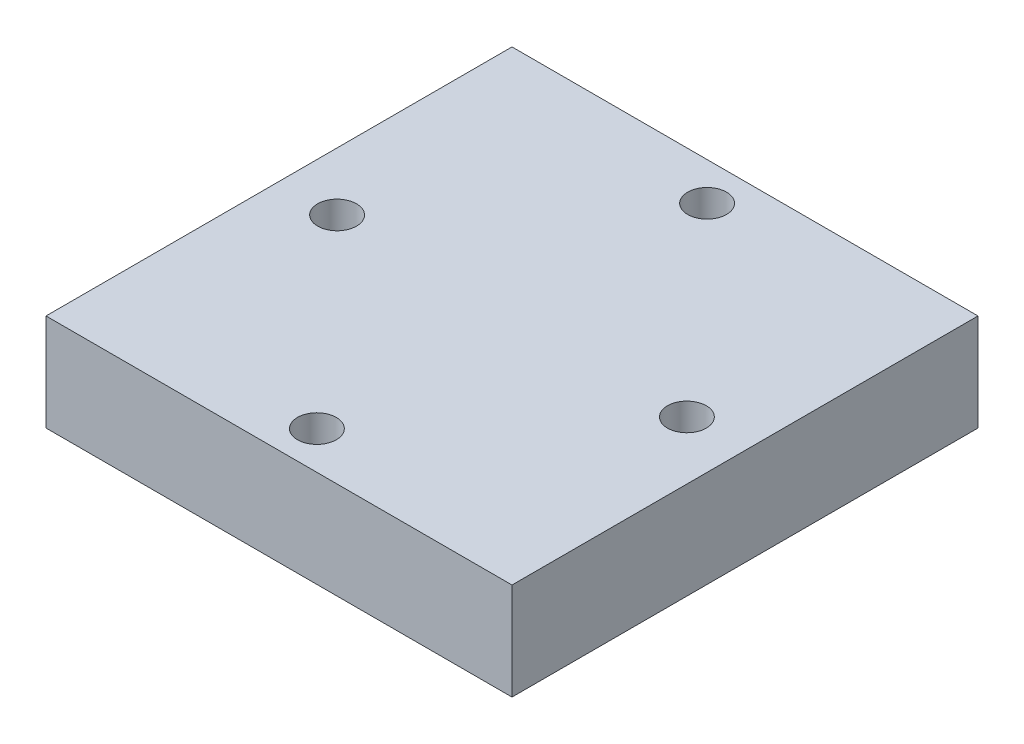
ISO-10303-21;
HEADER;
FILE_DESCRIPTION(('STEP AP214'),'2;1');
FILE_NAME('part.step','',(''),(''),'','','');
FILE_SCHEMA(('AUTOMOTIVE_DESIGN { 1 0 10303 214 1 1 1 1 }'));
ENDSEC;
DATA;
#1=APPLICATION_CONTEXT('core data for automotive mechanical design processes');
#2=APPLICATION_PROTOCOL_DEFINITION('international standard','automotive_design',2000,#1);
#3=PRODUCT_CONTEXT('',#1,'mechanical');
#4=PRODUCT('Part','Part','',(#3));
#5=PRODUCT_RELATED_PRODUCT_CATEGORY('part','',(#4));
#6=PRODUCT_DEFINITION_FORMATION('','',#4);
#7=PRODUCT_DEFINITION_CONTEXT('part definition',#1,'design');
#8=PRODUCT_DEFINITION('design','',#6,#7);
#9=PRODUCT_DEFINITION_SHAPE('','',#8);
#10=(LENGTH_UNIT() NAMED_UNIT(*) SI_UNIT(.MILLI.,.METRE.));
#11=(NAMED_UNIT(*) PLANE_ANGLE_UNIT() SI_UNIT($,.RADIAN.));
#12=(NAMED_UNIT(*) SI_UNIT($,.STERADIAN.) SOLID_ANGLE_UNIT());
#13=UNCERTAINTY_MEASURE_WITH_UNIT(LENGTH_MEASURE(1.E-05),#10,'distance_accuracy_value','');
#14=(GEOMETRIC_REPRESENTATION_CONTEXT(3) GLOBAL_UNCERTAINTY_ASSIGNED_CONTEXT((#13)) GLOBAL_UNIT_ASSIGNED_CONTEXT((#10,
#11,#12)) REPRESENTATION_CONTEXT('',''));
#15=CARTESIAN_POINT('',(0.,0.,0.));
#16=DIRECTION('',(0.,0.,1.));
#17=DIRECTION('',(1.,0.,0.));
#18=AXIS2_PLACEMENT_3D('',#15,#16,#17);
#19=CARTESIAN_POINT('',(0.,15.875,0.));
#20=DIRECTION('',(0.,-1.,0.));
#21=DIRECTION('',(0.,0.,-1.));
#22=AXIS2_PLACEMENT_3D('',#19,#20,#21);
#23=PLANE('',#22);
#24=CARTESIAN_POINT('',(9.49960000000001,15.875,-38.1));
#25=DIRECTION('',(0.,1.,0.));
#26=DIRECTION('',(0.,0.,1.));
#27=AXIS2_PLACEMENT_3D('',#24,#25,#26);
#28=CIRCLE('',#27,3.175);
#29=CARTESIAN_POINT('',(9.49960000000001,15.875,-34.925));
#30=VERTEX_POINT('',#29);
#31=EDGE_CURVE('E134',#30,#30,#28,.T.);
#32=ORIENTED_EDGE('',*,*,#31,.F.);
#33=EDGE_LOOP('',(#32));
#34=FACE_BOUND('',#33,.T.);
#35=CARTESIAN_POINT('',(38.0999999999999,15.875,-6.19771176000002));
#36=DIRECTION('',(0.,1.,0.));
#37=DIRECTION('',(0.,0.,1.));
#38=AXIS2_PLACEMENT_3D('',#35,#36,#37);
#39=CIRCLE('',#38,3.175);
#40=CARTESIAN_POINT('',(38.0999999999999,15.875,-3.02271176000002));
#41=VERTEX_POINT('',#40);
#42=EDGE_CURVE('E122',#41,#41,#39,.F.);
#43=ORIENTED_EDGE('',*,*,#42,.T.);
#44=EDGE_LOOP('',(#43));
#45=FACE_BOUND('',#44,.T.);
#46=CARTESIAN_POINT('',(38.1,15.875,-70.00228824));
#47=DIRECTION('',(0.,1.,0.));
#48=DIRECTION('',(0.,0.,1.));
#49=AXIS2_PLACEMENT_3D('',#46,#47,#48);
#50=CIRCLE('',#49,3.175);
#51=CARTESIAN_POINT('',(38.1,15.875,-66.82728824));
#52=VERTEX_POINT('',#51);
#53=EDGE_CURVE('E116',#52,#52,#50,.T.);
#54=ORIENTED_EDGE('',*,*,#53,.F.);
#55=EDGE_LOOP('',(#54));
#56=FACE_BOUND('',#55,.T.);
#57=DIRECTION('',(0.,0.,1.));
#58=VECTOR('',#57,1.);
#59=CARTESIAN_POINT('',(0.,15.875,0.));
#60=LINE('',#59,#58);
#61=CARTESIAN_POINT('',(0.,15.875,-76.2));
#62=VERTEX_POINT('',#61);
#63=CARTESIAN_POINT('',(0.,15.875,0.));
#64=VERTEX_POINT('',#63);
#65=EDGE_CURVE('E89',#62,#64,#60,.T.);
#66=ORIENTED_EDGE('',*,*,#65,.T.);
#67=DIRECTION('',(1.,0.,0.));
#68=VECTOR('',#67,1.);
#69=CARTESIAN_POINT('',(0.,15.875,0.));
#70=LINE('',#69,#68);
#71=CARTESIAN_POINT('',(76.2,15.875,0.));
#72=VERTEX_POINT('',#71);
#73=EDGE_CURVE('E84',#64,#72,#70,.T.);
#74=ORIENTED_EDGE('',*,*,#73,.T.);
#75=DIRECTION('',(0.,0.,-1.));
#76=VECTOR('',#75,1.);
#77=CARTESIAN_POINT('',(76.2,15.875,-76.2));
#78=LINE('',#77,#76);
#79=CARTESIAN_POINT('',(76.2,15.875,-76.2));
#80=VERTEX_POINT('',#79);
#81=EDGE_CURVE('E87',#72,#80,#78,.T.);
#82=ORIENTED_EDGE('',*,*,#81,.T.);
#83=DIRECTION('',(-1.,0.,0.));
#84=VECTOR('',#83,1.);
#85=CARTESIAN_POINT('',(0.,15.875,-76.2));
#86=LINE('',#85,#84);
#87=EDGE_CURVE('E54',#80,#62,#86,.T.);
#88=ORIENTED_EDGE('',*,*,#87,.T.);
#89=EDGE_LOOP('',(#66,#74,#82,#88));
#90=FACE_BOUND('',#89,.T.);
#91=CARTESIAN_POINT('',(66.7003999999999,15.875,-38.0999999999999));
#92=DIRECTION('',(0.,1.,0.));
#93=DIRECTION('',(0.,0.,1.));
#94=AXIS2_PLACEMENT_3D('',#91,#92,#93);
#95=CIRCLE('',#94,3.17500000000001);
#96=CARTESIAN_POINT('',(66.7003999999999,15.875,-34.9249999999999));
#97=VERTEX_POINT('',#96);
#98=EDGE_CURVE('E128',#97,#97,#95,.F.);
#99=ORIENTED_EDGE('',*,*,#98,.T.);
#100=EDGE_LOOP('',(#99));
#101=FACE_BOUND('',#100,.T.);
#102=ADVANCED_FACE('F37',(#34,#45,#56,#90,#101),#23,.F.);
#103=CARTESIAN_POINT('',(0.,0.,0.));
#104=DIRECTION('',(0.,-1.,0.));
#105=DIRECTION('',(0.,0.,-1.));
#106=AXIS2_PLACEMENT_3D('',#103,#104,#105);
#107=PLANE('',#106);
#108=CARTESIAN_POINT('',(9.49960000000001,0.,-38.1));
#109=DIRECTION('',(0.,1.,0.));
#110=DIRECTION('',(0.,0.,1.));
#111=AXIS2_PLACEMENT_3D('',#108,#109,#110);
#112=CIRCLE('',#111,3.175);
#113=CARTESIAN_POINT('',(9.49960000000001,0.,-34.925));
#114=VERTEX_POINT('',#113);
#115=EDGE_CURVE('E131',#114,#114,#112,.T.);
#116=ORIENTED_EDGE('',*,*,#115,.T.);
#117=EDGE_LOOP('',(#116));
#118=FACE_BOUND('',#117,.T.);
#119=CARTESIAN_POINT('',(38.0999999999999,0.,-6.19771176000002));
#120=DIRECTION('',(0.,1.,0.));
#121=DIRECTION('',(0.,0.,1.));
#122=AXIS2_PLACEMENT_3D('',#119,#120,#121);
#123=CIRCLE('',#122,3.175);
#124=CARTESIAN_POINT('',(38.0999999999999,0.,-3.02271176000002));
#125=VERTEX_POINT('',#124);
#126=EDGE_CURVE('E119',#125,#125,#123,.F.);
#127=ORIENTED_EDGE('',*,*,#126,.F.);
#128=EDGE_LOOP('',(#127));
#129=FACE_BOUND('',#128,.T.);
#130=CARTESIAN_POINT('',(38.1,0.,-70.00228824));
#131=DIRECTION('',(0.,1.,0.));
#132=DIRECTION('',(0.,0.,1.));
#133=AXIS2_PLACEMENT_3D('',#130,#131,#132);
#134=CIRCLE('',#133,3.175);
#135=CARTESIAN_POINT('',(38.1,0.,-66.82728824));
#136=VERTEX_POINT('',#135);
#137=EDGE_CURVE('E104',#136,#136,#134,.T.);
#138=ORIENTED_EDGE('',*,*,#137,.T.);
#139=EDGE_LOOP('',(#138));
#140=FACE_BOUND('',#139,.T.);
#141=DIRECTION('',(0.,0.,1.));
#142=VECTOR('',#141,1.);
#143=CARTESIAN_POINT('',(0.,0.,0.));
#144=LINE('',#143,#142);
#145=CARTESIAN_POINT('',(0.,0.,-76.2));
#146=VERTEX_POINT('',#145);
#147=CARTESIAN_POINT('',(0.,0.,0.));
#148=VERTEX_POINT('',#147);
#149=EDGE_CURVE('E101',#146,#148,#144,.T.);
#150=ORIENTED_EDGE('',*,*,#149,.F.);
#151=DIRECTION('',(-1.,0.,0.));
#152=VECTOR('',#151,1.);
#153=CARTESIAN_POINT('',(0.,0.,-76.2));
#154=LINE('',#153,#152);
#155=CARTESIAN_POINT('',(76.2,0.,-76.2));
#156=VERTEX_POINT('',#155);
#157=EDGE_CURVE('E77',#156,#146,#154,.T.);
#158=ORIENTED_EDGE('',*,*,#157,.F.);
#159=DIRECTION('',(0.,0.,-1.));
#160=VECTOR('',#159,1.);
#161=CARTESIAN_POINT('',(76.2,0.,-76.2));
#162=LINE('',#161,#160);
#163=CARTESIAN_POINT('',(76.2,0.,0.));
#164=VERTEX_POINT('',#163);
#165=EDGE_CURVE('E71',#164,#156,#162,.T.);
#166=ORIENTED_EDGE('',*,*,#165,.F.);
#167=DIRECTION('',(1.,0.,0.));
#168=VECTOR('',#167,1.);
#169=CARTESIAN_POINT('',(0.,0.,0.));
#170=LINE('',#169,#168);
#171=EDGE_CURVE('E93',#148,#164,#170,.T.);
#172=ORIENTED_EDGE('',*,*,#171,.F.);
#173=EDGE_LOOP('',(#150,#158,#166,#172));
#174=FACE_BOUND('',#173,.T.);
#175=CARTESIAN_POINT('',(66.7003999999999,0.,-38.0999999999999));
#176=DIRECTION('',(0.,1.,0.));
#177=DIRECTION('',(0.,0.,1.));
#178=AXIS2_PLACEMENT_3D('',#175,#176,#177);
#179=CIRCLE('',#178,3.17500000000001);
#180=CARTESIAN_POINT('',(66.7003999999999,0.,-34.9249999999999));
#181=VERTEX_POINT('',#180);
#182=EDGE_CURVE('E125',#181,#181,#179,.F.);
#183=ORIENTED_EDGE('',*,*,#182,.F.);
#184=EDGE_LOOP('',(#183));
#185=FACE_BOUND('',#184,.T.);
#186=ADVANCED_FACE('F112',(#118,#129,#140,#174,#185),#107,.T.);
#187=CARTESIAN_POINT('',(0.,15.875,0.));
#188=DIRECTION('',(1.,0.,0.));
#189=DIRECTION('',(0.,0.,-1.));
#190=AXIS2_PLACEMENT_3D('',#187,#188,#189);
#191=PLANE('',#190);
#192=ORIENTED_EDGE('',*,*,#149,.T.);
#193=DIRECTION('',(0.,-1.,0.));
#194=VECTOR('',#193,1.);
#195=CARTESIAN_POINT('',(0.,15.875,0.));
#196=LINE('',#195,#194);
#197=EDGE_CURVE('E11',#64,#148,#196,.T.);
#198=ORIENTED_EDGE('',*,*,#197,.F.);
#199=ORIENTED_EDGE('',*,*,#65,.F.);
#200=DIRECTION('',(0.,-1.,0.));
#201=VECTOR('',#200,1.);
#202=CARTESIAN_POINT('',(0.,15.875,-76.2));
#203=LINE('',#202,#201);
#204=EDGE_CURVE('E97',#62,#146,#203,.T.);
#205=ORIENTED_EDGE('',*,*,#204,.T.);
#206=EDGE_LOOP('',(#192,#198,#199,#205));
#207=FACE_BOUND('',#206,.T.);
#208=ADVANCED_FACE('F39',(#207),#191,.F.);
#209=CARTESIAN_POINT('',(0.,15.875,0.));
#210=DIRECTION('',(0.,0.,-1.));
#211=DIRECTION('',(-1.,0.,0.));
#212=AXIS2_PLACEMENT_3D('',#209,#210,#211);
#213=PLANE('',#212);
#214=ORIENTED_EDGE('',*,*,#171,.T.);
#215=DIRECTION('',(0.,-1.,0.));
#216=VECTOR('',#215,1.);
#217=CARTESIAN_POINT('',(76.2,15.875,0.));
#218=LINE('',#217,#216);
#219=EDGE_CURVE('E46',#72,#164,#218,.T.);
#220=ORIENTED_EDGE('',*,*,#219,.F.);
#221=ORIENTED_EDGE('',*,*,#73,.F.);
#222=ORIENTED_EDGE('',*,*,#197,.T.);
#223=EDGE_LOOP('',(#214,#220,#221,#222));
#224=FACE_BOUND('',#223,.T.);
#225=ADVANCED_FACE('F92',(#224),#213,.F.);
#226=CARTESIAN_POINT('',(76.2,15.875,-76.2));
#227=DIRECTION('',(-1.,0.,0.));
#228=DIRECTION('',(0.,0.,1.));
#229=AXIS2_PLACEMENT_3D('',#226,#227,#228);
#230=PLANE('',#229);
#231=ORIENTED_EDGE('',*,*,#165,.T.);
#232=DIRECTION('',(0.,-1.,0.));
#233=VECTOR('',#232,1.);
#234=CARTESIAN_POINT('',(76.2,15.875,-76.2));
#235=LINE('',#234,#233);
#236=EDGE_CURVE('E94',#80,#156,#235,.T.);
#237=ORIENTED_EDGE('',*,*,#236,.F.);
#238=ORIENTED_EDGE('',*,*,#81,.F.);
#239=ORIENTED_EDGE('',*,*,#219,.T.);
#240=EDGE_LOOP('',(#231,#237,#238,#239));
#241=FACE_BOUND('',#240,.T.);
#242=ADVANCED_FACE('F95',(#241),#230,.F.);
#243=CARTESIAN_POINT('',(0.,15.875,-76.2));
#244=DIRECTION('',(0.,0.,1.));
#245=DIRECTION('',(1.,0.,0.));
#246=AXIS2_PLACEMENT_3D('',#243,#244,#245);
#247=PLANE('',#246);
#248=ORIENTED_EDGE('',*,*,#157,.T.);
#249=ORIENTED_EDGE('',*,*,#204,.F.);
#250=ORIENTED_EDGE('',*,*,#87,.F.);
#251=ORIENTED_EDGE('',*,*,#236,.T.);
#252=EDGE_LOOP('',(#248,#249,#250,#251));
#253=FACE_BOUND('',#252,.T.);
#254=ADVANCED_FACE('F109',(#253),#247,.F.);
#255=CARTESIAN_POINT('',(38.1,0.,-70.00228824));
#256=DIRECTION('',(0.,1.,0.));
#257=DIRECTION('',(0.,0.,1.));
#258=AXIS2_PLACEMENT_3D('',#255,#256,#257);
#259=CYLINDRICAL_SURFACE('',#258,3.175);
#260=ORIENTED_EDGE('',*,*,#137,.F.);
#261=EDGE_LOOP('',(#260));
#262=FACE_BOUND('',#261,.T.);
#263=ORIENTED_EDGE('',*,*,#53,.T.);
#264=EDGE_LOOP('',(#263));
#265=FACE_BOUND('',#264,.T.);
#266=ADVANCED_FACE('F156',(#262,#265),#259,.F.);
#267=CARTESIAN_POINT('',(38.0999999999999,0.,-6.19771176000002));
#268=DIRECTION('',(0.,1.,0.));
#269=DIRECTION('',(0.,0.,1.));
#270=AXIS2_PLACEMENT_3D('',#267,#268,#269);
#271=CYLINDRICAL_SURFACE('',#270,3.175);
#272=ORIENTED_EDGE('',*,*,#126,.T.);
#273=EDGE_LOOP('',(#272));
#274=FACE_BOUND('',#273,.T.);
#275=ORIENTED_EDGE('',*,*,#42,.F.);
#276=EDGE_LOOP('',(#275));
#277=FACE_BOUND('',#276,.T.);
#278=ADVANCED_FACE('F158',(#274,#277),#271,.F.);
#279=CARTESIAN_POINT('',(66.7003999999999,0.,-38.0999999999999));
#280=DIRECTION('',(0.,1.,0.));
#281=DIRECTION('',(0.,0.,1.));
#282=AXIS2_PLACEMENT_3D('',#279,#280,#281);
#283=CYLINDRICAL_SURFACE('',#282,3.17500000000001);
#284=ORIENTED_EDGE('',*,*,#182,.T.);
#285=EDGE_LOOP('',(#284));
#286=FACE_BOUND('',#285,.T.);
#287=ORIENTED_EDGE('',*,*,#98,.F.);
#288=EDGE_LOOP('',(#287));
#289=FACE_BOUND('',#288,.T.);
#290=ADVANCED_FACE('F145',(#286,#289),#283,.F.);
#291=CARTESIAN_POINT('',(9.49960000000001,0.,-38.1));
#292=DIRECTION('',(0.,1.,0.));
#293=DIRECTION('',(0.,0.,1.));
#294=AXIS2_PLACEMENT_3D('',#291,#292,#293);
#295=CYLINDRICAL_SURFACE('',#294,3.175);
#296=ORIENTED_EDGE('',*,*,#115,.F.);
#297=EDGE_LOOP('',(#296));
#298=FACE_BOUND('',#297,.T.);
#299=ORIENTED_EDGE('',*,*,#31,.T.);
#300=EDGE_LOOP('',(#299));
#301=FACE_BOUND('',#300,.T.);
#302=ADVANCED_FACE('F142',(#298,#301),#295,.F.);
#303=CLOSED_SHELL('',(#102,#186,#208,#225,#242,#254,#266,#278,#290,#302));
#304=MANIFOLD_SOLID_BREP('B2',#303);
#305=ADVANCED_BREP_SHAPE_REPRESENTATION('',(#18,#304),#14);
#306=SHAPE_DEFINITION_REPRESENTATION(#9,#305);
ENDSEC;
END-ISO-10303-21;
